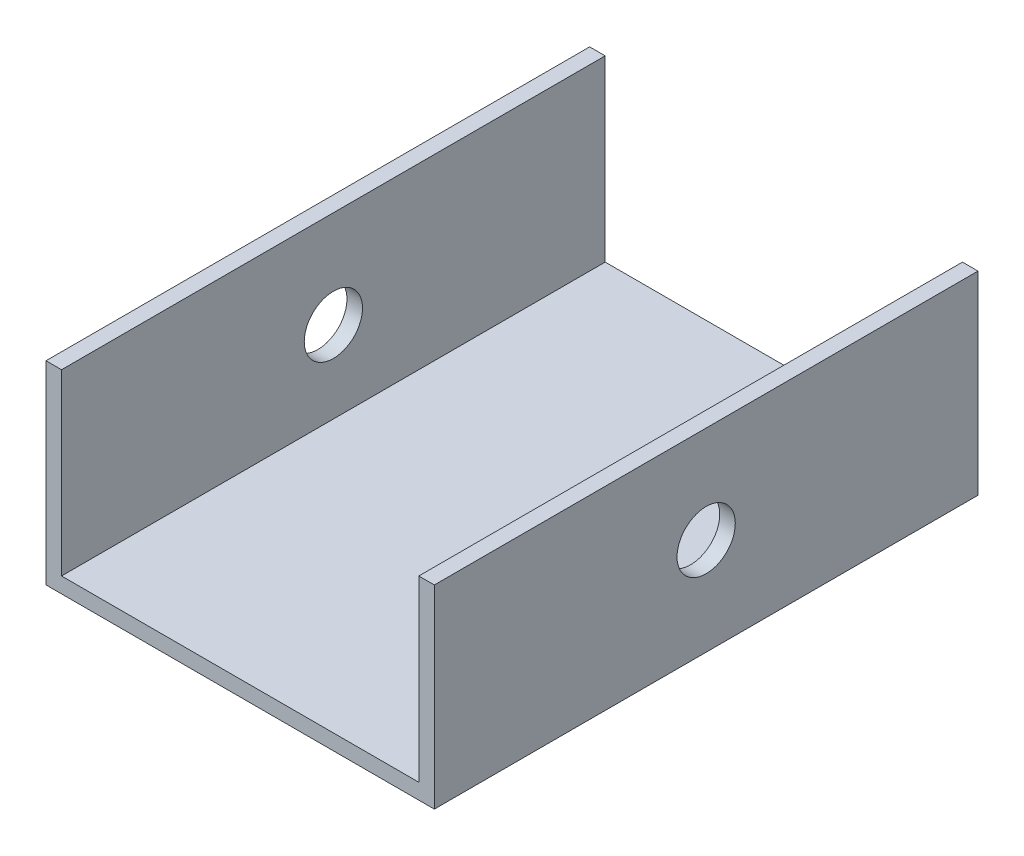
ISO-10303-21;
HEADER;
FILE_DESCRIPTION(('STEP AP214'),'2;1');
FILE_NAME('part.step','',(''),(''),'','','');
FILE_SCHEMA(('AUTOMOTIVE_DESIGN { 1 0 10303 214 1 1 1 1 }'));
ENDSEC;
DATA;
#1=APPLICATION_CONTEXT('core data for automotive mechanical design processes');
#2=APPLICATION_PROTOCOL_DEFINITION('international standard','automotive_design',2000,#1);
#3=PRODUCT_CONTEXT('',#1,'mechanical');
#4=PRODUCT('Part','Part','',(#3));
#5=PRODUCT_RELATED_PRODUCT_CATEGORY('part','',(#4));
#6=PRODUCT_DEFINITION_FORMATION('','',#4);
#7=PRODUCT_DEFINITION_CONTEXT('part definition',#1,'design');
#8=PRODUCT_DEFINITION('design','',#6,#7);
#9=PRODUCT_DEFINITION_SHAPE('','',#8);
#10=(LENGTH_UNIT() NAMED_UNIT(*) SI_UNIT(.MILLI.,.METRE.));
#11=(NAMED_UNIT(*) PLANE_ANGLE_UNIT() SI_UNIT($,.RADIAN.));
#12=(NAMED_UNIT(*) SI_UNIT($,.STERADIAN.) SOLID_ANGLE_UNIT());
#13=UNCERTAINTY_MEASURE_WITH_UNIT(LENGTH_MEASURE(1.E-05),#10,'distance_accuracy_value','');
#14=(GEOMETRIC_REPRESENTATION_CONTEXT(3) GLOBAL_UNCERTAINTY_ASSIGNED_CONTEXT((#13)) GLOBAL_UNIT_ASSIGNED_CONTEXT((#10,
#11,#12)) REPRESENTATION_CONTEXT('',''));
#15=CARTESIAN_POINT('',(0.,0.,0.));
#16=DIRECTION('',(0.,0.,1.));
#17=DIRECTION('',(1.,0.,0.));
#18=AXIS2_PLACEMENT_3D('',#15,#16,#17);
#19=CARTESIAN_POINT('',(-38.824195441247,25.8663366699608,140.));
#20=DIRECTION('',(1.,0.,0.));
#21=DIRECTION('',(0.,1.,0.));
#22=AXIS2_PLACEMENT_3D('',#19,#20,#21);
#23=PLANE('',#22);
#24=CARTESIAN_POINT('',(-38.824195441247,0.866336593960749,70.));
#25=DIRECTION('',(1.,0.,0.));
#26=DIRECTION('',(0.,1.,0.));
#27=AXIS2_PLACEMENT_3D('',#24,#25,#26);
#28=CIRCLE('',#27,7.50000000000001);
#29=CARTESIAN_POINT('',(-38.824195441247,8.36633659396076,70.));
#30=VERTEX_POINT('',#29);
#31=EDGE_CURVE('E184',#30,#30,#28,.T.);
#32=ORIENTED_EDGE('',*,*,#31,.T.);
#33=EDGE_LOOP('',(#32));
#34=FACE_BOUND('',#33,.T.);
#35=DIRECTION('',(0.,-1.,0.));
#36=VECTOR('',#35,1.);
#37=CARTESIAN_POINT('',(-38.824195441247,25.8663366699608,0.));
#38=LINE('',#37,#36);
#39=CARTESIAN_POINT('',(-38.824195441247,25.8663366699608,0.));
#40=VERTEX_POINT('',#39);
#41=CARTESIAN_POINT('',(-38.824195441247,-24.1336634060392,0.));
#42=VERTEX_POINT('',#41);
#43=EDGE_CURVE('E130',#40,#42,#38,.T.);
#44=ORIENTED_EDGE('',*,*,#43,.T.);
#45=DIRECTION('',(0.,0.,-1.));
#46=VECTOR('',#45,1.);
#47=CARTESIAN_POINT('',(-38.824195441247,-24.1336634060392,140.));
#48=LINE('',#47,#46);
#49=CARTESIAN_POINT('',(-38.824195441247,-24.1336634060392,140.));
#50=VERTEX_POINT('',#49);
#51=EDGE_CURVE('E11',#50,#42,#48,.T.);
#52=ORIENTED_EDGE('',*,*,#51,.F.);
#53=DIRECTION('',(0.,-1.,0.));
#54=VECTOR('',#53,1.);
#55=CARTESIAN_POINT('',(-38.824195441247,25.8663366699608,140.));
#56=LINE('',#55,#54);
#57=CARTESIAN_POINT('',(-38.824195441247,25.8663366699608,140.));
#58=VERTEX_POINT('',#57);
#59=EDGE_CURVE('E145',#58,#50,#56,.T.);
#60=ORIENTED_EDGE('',*,*,#59,.F.);
#61=DIRECTION('',(0.,0.,-1.));
#62=VECTOR('',#61,1.);
#63=CARTESIAN_POINT('',(-38.824195441247,25.8663366699608,140.));
#64=LINE('',#63,#62);
#65=EDGE_CURVE('E126',#58,#40,#64,.T.);
#66=ORIENTED_EDGE('',*,*,#65,.T.);
#67=EDGE_LOOP('',(#44,#52,#60,#66));
#68=FACE_BOUND('',#67,.T.);
#69=ADVANCED_FACE('F33',(#34,#68),#23,.F.);
#70=CARTESIAN_POINT('',(-38.824195441247,-24.1336634060392,140.));
#71=DIRECTION('',(0.,1.,0.));
#72=DIRECTION('',(-1.,0.,0.));
#73=AXIS2_PLACEMENT_3D('',#70,#71,#72);
#74=PLANE('',#73);
#75=DIRECTION('',(1.,0.,0.));
#76=VECTOR('',#75,1.);
#77=CARTESIAN_POINT('',(-38.824195441247,-24.1336634060392,0.));
#78=LINE('',#77,#76);
#79=CARTESIAN_POINT('',(61.175804558753,-24.1336634060392,0.));
#80=VERTEX_POINT('',#79);
#81=EDGE_CURVE('E133',#42,#80,#78,.T.);
#82=ORIENTED_EDGE('',*,*,#81,.T.);
#83=DIRECTION('',(0.,0.,-1.));
#84=VECTOR('',#83,1.);
#85=CARTESIAN_POINT('',(61.175804558753,-24.1336634060392,140.));
#86=LINE('',#85,#84);
#87=CARTESIAN_POINT('',(61.175804558753,-24.1336634060392,140.));
#88=VERTEX_POINT('',#87);
#89=EDGE_CURVE('E42',#88,#80,#86,.T.);
#90=ORIENTED_EDGE('',*,*,#89,.F.);
#91=DIRECTION('',(1.,0.,0.));
#92=VECTOR('',#91,1.);
#93=CARTESIAN_POINT('',(-38.824195441247,-24.1336634060392,140.));
#94=LINE('',#93,#92);
#95=EDGE_CURVE('E93',#50,#88,#94,.T.);
#96=ORIENTED_EDGE('',*,*,#95,.F.);
#97=ORIENTED_EDGE('',*,*,#51,.T.);
#98=EDGE_LOOP('',(#82,#90,#96,#97));
#99=FACE_BOUND('',#98,.T.);
#100=ADVANCED_FACE('F205',(#99),#74,.F.);
#101=CARTESIAN_POINT('',(61.175804558753,25.8663365939608,140.));
#102=DIRECTION('',(-1.,0.,0.));
#103=DIRECTION('',(0.,-1.,0.));
#104=AXIS2_PLACEMENT_3D('',#101,#102,#103);
#105=PLANE('',#104);
#106=CARTESIAN_POINT('',(61.175804558753,0.866336593960763,70.));
#107=DIRECTION('',(-1.,0.,0.));
#108=DIRECTION('',(0.,-1.,0.));
#109=AXIS2_PLACEMENT_3D('',#106,#107,#108);
#110=CIRCLE('',#109,7.50000000000001);
#111=CARTESIAN_POINT('',(61.175804558753,-6.63366340603925,70.));
#112=VERTEX_POINT('',#111);
#113=EDGE_CURVE('E134',#112,#112,#110,.T.);
#114=ORIENTED_EDGE('',*,*,#113,.T.);
#115=EDGE_LOOP('',(#114));
#116=FACE_BOUND('',#115,.T.);
#117=DIRECTION('',(0.,1.,0.));
#118=VECTOR('',#117,1.);
#119=CARTESIAN_POINT('',(61.175804558753,25.8663365939608,0.));
#120=LINE('',#119,#118);
#121=CARTESIAN_POINT('',(61.175804558753,25.8663365939608,0.));
#122=VERTEX_POINT('',#121);
#123=EDGE_CURVE('E136',#80,#122,#120,.T.);
#124=ORIENTED_EDGE('',*,*,#123,.T.);
#125=DIRECTION('',(0.,0.,-1.));
#126=VECTOR('',#125,1.);
#127=CARTESIAN_POINT('',(61.175804558753,25.8663365939608,140.));
#128=LINE('',#127,#126);
#129=CARTESIAN_POINT('',(61.175804558753,25.8663365939608,140.));
#130=VERTEX_POINT('',#129);
#131=EDGE_CURVE('E152',#130,#122,#128,.T.);
#132=ORIENTED_EDGE('',*,*,#131,.F.);
#133=DIRECTION('',(0.,1.,0.));
#134=VECTOR('',#133,1.);
#135=CARTESIAN_POINT('',(61.175804558753,25.8663365939608,140.));
#136=LINE('',#135,#134);
#137=EDGE_CURVE('E161',#88,#130,#136,.T.);
#138=ORIENTED_EDGE('',*,*,#137,.F.);
#139=ORIENTED_EDGE('',*,*,#89,.T.);
#140=EDGE_LOOP('',(#124,#132,#138,#139));
#141=FACE_BOUND('',#140,.T.);
#142=ADVANCED_FACE('F159',(#116,#141),#105,.F.);
#143=CARTESIAN_POINT('',(57.175804454753,25.8663365939608,140.));
#144=DIRECTION('',(0.,-1.,0.));
#145=DIRECTION('',(0.,0.,-1.));
#146=AXIS2_PLACEMENT_3D('',#143,#144,#145);
#147=PLANE('',#146);
#148=DIRECTION('',(-1.,0.,0.));
#149=VECTOR('',#148,1.);
#150=CARTESIAN_POINT('',(57.175804454753,25.8663365939608,0.));
#151=LINE('',#150,#149);
#152=CARTESIAN_POINT('',(57.175804454753,25.8663365939608,0.));
#153=VERTEX_POINT('',#152);
#154=EDGE_CURVE('E138',#122,#153,#151,.T.);
#155=ORIENTED_EDGE('',*,*,#154,.T.);
#156=DIRECTION('',(0.,0.,-1.));
#157=VECTOR('',#156,1.);
#158=CARTESIAN_POINT('',(57.175804454753,25.8663365939608,140.));
#159=LINE('',#158,#157);
#160=CARTESIAN_POINT('',(57.175804454753,25.8663365939608,140.));
#161=VERTEX_POINT('',#160);
#162=EDGE_CURVE('E149',#161,#153,#159,.T.);
#163=ORIENTED_EDGE('',*,*,#162,.F.);
#164=DIRECTION('',(-1.,0.,0.));
#165=VECTOR('',#164,1.);
#166=CARTESIAN_POINT('',(57.175804454753,25.8663365939608,140.));
#167=LINE('',#166,#165);
#168=EDGE_CURVE('E173',#130,#161,#167,.T.);
#169=ORIENTED_EDGE('',*,*,#168,.F.);
#170=ORIENTED_EDGE('',*,*,#131,.T.);
#171=EDGE_LOOP('',(#155,#163,#169,#170));
#172=FACE_BOUND('',#171,.T.);
#173=ADVANCED_FACE('F169',(#172),#147,.F.);
#174=CARTESIAN_POINT('',(57.175804454753,25.8663365939608,140.));
#175=DIRECTION('',(1.,0.,0.));
#176=DIRECTION('',(0.,1.,0.));
#177=AXIS2_PLACEMENT_3D('',#174,#175,#176);
#178=PLANE('',#177);
#179=CARTESIAN_POINT('',(57.175804454753,0.866336593960762,70.));
#180=DIRECTION('',(1.,0.,0.));
#181=DIRECTION('',(0.,1.,0.));
#182=AXIS2_PLACEMENT_3D('',#179,#180,#181);
#183=CIRCLE('',#182,7.50000000000001);
#184=CARTESIAN_POINT('',(57.175804454753,8.36633659396078,70.));
#185=VERTEX_POINT('',#184);
#186=EDGE_CURVE('E181',#185,#185,#183,.T.);
#187=ORIENTED_EDGE('',*,*,#186,.T.);
#188=EDGE_LOOP('',(#187));
#189=FACE_BOUND('',#188,.T.);
#190=DIRECTION('',(0.,-1.,0.));
#191=VECTOR('',#190,1.);
#192=CARTESIAN_POINT('',(57.175804454753,25.8663365939608,0.));
#193=LINE('',#192,#191);
#194=CARTESIAN_POINT('',(57.175804454753,-20.1336632780392,0.));
#195=VERTEX_POINT('',#194);
#196=EDGE_CURVE('E140',#153,#195,#193,.T.);
#197=ORIENTED_EDGE('',*,*,#196,.T.);
#198=DIRECTION('',(0.,0.,-1.));
#199=VECTOR('',#198,1.);
#200=CARTESIAN_POINT('',(57.175804454753,-20.1336632780392,140.));
#201=LINE('',#200,#199);
#202=CARTESIAN_POINT('',(57.175804454753,-20.1336632780392,140.));
#203=VERTEX_POINT('',#202);
#204=EDGE_CURVE('E121',#203,#195,#201,.T.);
#205=ORIENTED_EDGE('',*,*,#204,.F.);
#206=DIRECTION('',(0.,-1.,0.));
#207=VECTOR('',#206,1.);
#208=CARTESIAN_POINT('',(57.175804454753,25.8663365939608,140.));
#209=LINE('',#208,#207);
#210=EDGE_CURVE('E112',#161,#203,#209,.T.);
#211=ORIENTED_EDGE('',*,*,#210,.F.);
#212=ORIENTED_EDGE('',*,*,#162,.T.);
#213=EDGE_LOOP('',(#197,#205,#211,#212));
#214=FACE_BOUND('',#213,.T.);
#215=ADVANCED_FACE('F172',(#189,#214),#178,.F.);
#216=CARTESIAN_POINT('',(-34.824195441247,-20.1336632780392,140.));
#217=DIRECTION('',(0.,-1.,0.));
#218=DIRECTION('',(0.,0.,-1.));
#219=AXIS2_PLACEMENT_3D('',#216,#217,#218);
#220=PLANE('',#219);
#221=DIRECTION('',(-1.,0.,0.));
#222=VECTOR('',#221,1.);
#223=CARTESIAN_POINT('',(-34.824195441247,-20.1336632780392,0.));
#224=LINE('',#223,#222);
#225=CARTESIAN_POINT('',(-34.824195441247,-20.1336632780392,0.));
#226=VERTEX_POINT('',#225);
#227=EDGE_CURVE('E120',#195,#226,#224,.T.);
#228=ORIENTED_EDGE('',*,*,#227,.T.);
#229=DIRECTION('',(0.,0.,-1.));
#230=VECTOR('',#229,1.);
#231=CARTESIAN_POINT('',(-34.824195441247,-20.1336632780392,140.));
#232=LINE('',#231,#230);
#233=CARTESIAN_POINT('',(-34.824195441247,-20.1336632780392,140.));
#234=VERTEX_POINT('',#233);
#235=EDGE_CURVE('E117',#234,#226,#232,.T.);
#236=ORIENTED_EDGE('',*,*,#235,.F.);
#237=DIRECTION('',(-1.,0.,0.));
#238=VECTOR('',#237,1.);
#239=CARTESIAN_POINT('',(-34.824195441247,-20.1336632780392,140.));
#240=LINE('',#239,#238);
#241=EDGE_CURVE('E106',#203,#234,#240,.T.);
#242=ORIENTED_EDGE('',*,*,#241,.F.);
#243=ORIENTED_EDGE('',*,*,#204,.T.);
#244=EDGE_LOOP('',(#228,#236,#242,#243));
#245=FACE_BOUND('',#244,.T.);
#246=ADVANCED_FACE('F118',(#245),#220,.F.);
#247=CARTESIAN_POINT('',(-34.824195441247,25.8663366699608,140.));
#248=DIRECTION('',(-1.,0.,0.));
#249=DIRECTION('',(0.,-1.,0.));
#250=AXIS2_PLACEMENT_3D('',#247,#248,#249);
#251=PLANE('',#250);
#252=CARTESIAN_POINT('',(-34.824195441247,0.866336593960749,70.));
#253=DIRECTION('',(-1.,0.,0.));
#254=DIRECTION('',(0.,-1.,0.));
#255=AXIS2_PLACEMENT_3D('',#252,#253,#254);
#256=CIRCLE('',#255,7.50000000000001);
#257=CARTESIAN_POINT('',(-34.824195441247,-6.63366340603926,70.));
#258=VERTEX_POINT('',#257);
#259=EDGE_CURVE('E36',#258,#258,#256,.T.);
#260=ORIENTED_EDGE('',*,*,#259,.T.);
#261=EDGE_LOOP('',(#260));
#262=FACE_BOUND('',#261,.T.);
#263=DIRECTION('',(0.,1.,0.));
#264=VECTOR('',#263,1.);
#265=CARTESIAN_POINT('',(-34.824195441247,25.8663366699608,0.));
#266=LINE('',#265,#264);
#267=CARTESIAN_POINT('',(-34.824195441247,25.8663366699608,0.));
#268=VERTEX_POINT('',#267);
#269=EDGE_CURVE('E79',#226,#268,#266,.T.);
#270=ORIENTED_EDGE('',*,*,#269,.T.);
#271=DIRECTION('',(0.,0.,-1.));
#272=VECTOR('',#271,1.);
#273=CARTESIAN_POINT('',(-34.824195441247,25.8663366699608,140.));
#274=LINE('',#273,#272);
#275=CARTESIAN_POINT('',(-34.824195441247,25.8663366699608,140.));
#276=VERTEX_POINT('',#275);
#277=EDGE_CURVE('E122',#276,#268,#274,.T.);
#278=ORIENTED_EDGE('',*,*,#277,.F.);
#279=DIRECTION('',(0.,1.,0.));
#280=VECTOR('',#279,1.);
#281=CARTESIAN_POINT('',(-34.824195441247,25.8663366699608,140.));
#282=LINE('',#281,#280);
#283=EDGE_CURVE('E110',#234,#276,#282,.T.);
#284=ORIENTED_EDGE('',*,*,#283,.F.);
#285=ORIENTED_EDGE('',*,*,#235,.T.);
#286=EDGE_LOOP('',(#270,#278,#284,#285));
#287=FACE_BOUND('',#286,.T.);
#288=ADVANCED_FACE('F124',(#262,#287),#251,.F.);
#289=CARTESIAN_POINT('',(-38.824195441247,25.8663366699608,140.));
#290=DIRECTION('',(0.,-1.,0.));
#291=DIRECTION('',(0.,0.,-1.));
#292=AXIS2_PLACEMENT_3D('',#289,#290,#291);
#293=PLANE('',#292);
#294=DIRECTION('',(-1.,0.,0.));
#295=VECTOR('',#294,1.);
#296=CARTESIAN_POINT('',(-38.824195441247,25.8663366699608,0.));
#297=LINE('',#296,#295);
#298=EDGE_CURVE('E85',#268,#40,#297,.T.);
#299=ORIENTED_EDGE('',*,*,#298,.T.);
#300=ORIENTED_EDGE('',*,*,#65,.F.);
#301=DIRECTION('',(-1.,0.,0.));
#302=VECTOR('',#301,1.);
#303=CARTESIAN_POINT('',(-38.824195441247,25.8663366699608,140.));
#304=LINE('',#303,#302);
#305=EDGE_CURVE('E50',#276,#58,#304,.T.);
#306=ORIENTED_EDGE('',*,*,#305,.F.);
#307=ORIENTED_EDGE('',*,*,#277,.T.);
#308=EDGE_LOOP('',(#299,#300,#306,#307));
#309=FACE_BOUND('',#308,.T.);
#310=ADVANCED_FACE('F212',(#309),#293,.F.);
#311=CARTESIAN_POINT('',(0.,0.,140.));
#312=DIRECTION('',(0.,0.,1.));
#313=DIRECTION('',(1.,0.,0.));
#314=AXIS2_PLACEMENT_3D('',#311,#312,#313);
#315=PLANE('',#314);
#316=ORIENTED_EDGE('',*,*,#59,.T.);
#317=ORIENTED_EDGE('',*,*,#95,.T.);
#318=ORIENTED_EDGE('',*,*,#137,.T.);
#319=ORIENTED_EDGE('',*,*,#168,.T.);
#320=ORIENTED_EDGE('',*,*,#210,.T.);
#321=ORIENTED_EDGE('',*,*,#241,.T.);
#322=ORIENTED_EDGE('',*,*,#283,.T.);
#323=ORIENTED_EDGE('',*,*,#305,.T.);
#324=EDGE_LOOP('',(#316,#317,#318,#319,#320,#321,#322,#323));
#325=FACE_BOUND('',#324,.T.);
#326=ADVANCED_FACE('F108',(#325),#315,.T.);
#327=CARTESIAN_POINT('',(0.,0.,0.));
#328=DIRECTION('',(0.,0.,1.));
#329=DIRECTION('',(1.,0.,0.));
#330=AXIS2_PLACEMENT_3D('',#327,#328,#329);
#331=PLANE('',#330);
#332=ORIENTED_EDGE('',*,*,#43,.F.);
#333=ORIENTED_EDGE('',*,*,#298,.F.);
#334=ORIENTED_EDGE('',*,*,#269,.F.);
#335=ORIENTED_EDGE('',*,*,#227,.F.);
#336=ORIENTED_EDGE('',*,*,#196,.F.);
#337=ORIENTED_EDGE('',*,*,#154,.F.);
#338=ORIENTED_EDGE('',*,*,#123,.F.);
#339=ORIENTED_EDGE('',*,*,#81,.F.);
#340=EDGE_LOOP('',(#332,#333,#334,#335,#336,#337,#338,#339));
#341=FACE_BOUND('',#340,.T.);
#342=ADVANCED_FACE('F165',(#341),#331,.F.);
#343=CARTESIAN_POINT('',(-38.824195441247,0.866336593960749,70.));
#344=DIRECTION('',(1.,0.,0.));
#345=DIRECTION('',(0.,1.,0.));
#346=AXIS2_PLACEMENT_3D('',#343,#344,#345);
#347=CYLINDRICAL_SURFACE('',#346,7.50000000000001);
#348=ORIENTED_EDGE('',*,*,#31,.F.);
#349=EDGE_LOOP('',(#348));
#350=FACE_BOUND('',#349,.T.);
#351=ORIENTED_EDGE('',*,*,#259,.F.);
#352=EDGE_LOOP('',(#351));
#353=FACE_BOUND('',#352,.T.);
#354=ADVANCED_FACE('F192',(#350,#353),#347,.F.);
#355=ORIENTED_EDGE('',*,*,#186,.F.);
#356=EDGE_LOOP('',(#355));
#357=FACE_BOUND('',#356,.T.);
#358=ORIENTED_EDGE('',*,*,#113,.F.);
#359=EDGE_LOOP('',(#358));
#360=FACE_BOUND('',#359,.T.);
#361=ADVANCED_FACE('F194',(#357,#360),#347,.F.);
#362=CLOSED_SHELL('',(#69,#100,#142,#173,#215,#246,#288,#310,#326,#342,#354,#361));
#363=MANIFOLD_SOLID_BREP('B2',#362);
#364=ADVANCED_BREP_SHAPE_REPRESENTATION('',(#18,#363),#14);
#365=SHAPE_DEFINITION_REPRESENTATION(#9,#364);
ENDSEC;
END-ISO-10303-21;
